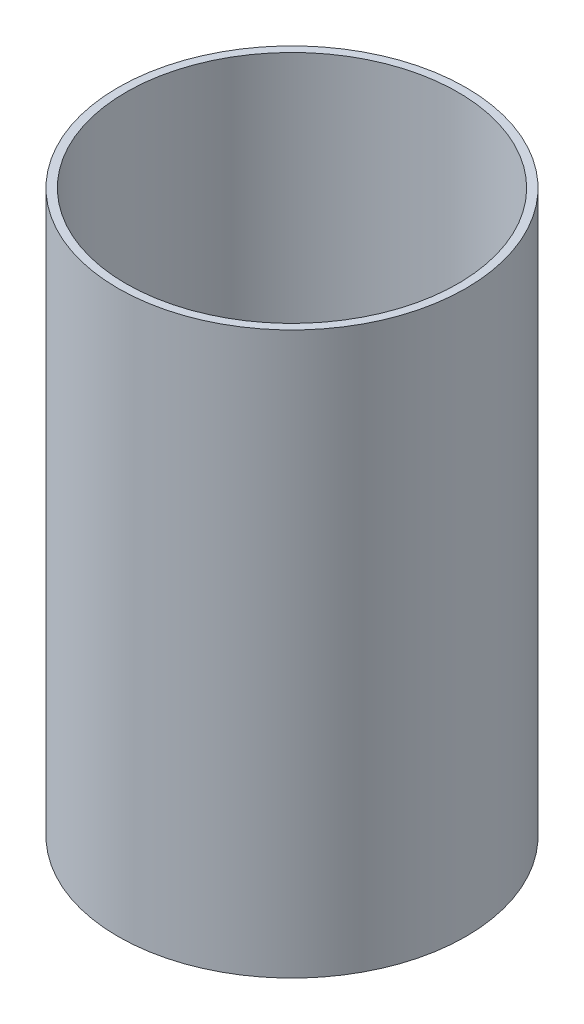
ISO-10303-21;
HEADER;
FILE_DESCRIPTION(('STEP AP214'),'2;1');
FILE_NAME('part.step','',(''),(''),'','','');
FILE_SCHEMA(('AUTOMOTIVE_DESIGN { 1 0 10303 214 1 1 1 1 }'));
ENDSEC;
DATA;
#1=APPLICATION_CONTEXT('core data for automotive mechanical design processes');
#2=APPLICATION_PROTOCOL_DEFINITION('international standard','automotive_design',2000,#1);
#3=PRODUCT_CONTEXT('',#1,'mechanical');
#4=PRODUCT('Part','Part','',(#3));
#5=PRODUCT_RELATED_PRODUCT_CATEGORY('part','',(#4));
#6=PRODUCT_DEFINITION_FORMATION('','',#4);
#7=PRODUCT_DEFINITION_CONTEXT('part definition',#1,'design');
#8=PRODUCT_DEFINITION('design','',#6,#7);
#9=PRODUCT_DEFINITION_SHAPE('','',#8);
#10=(LENGTH_UNIT() NAMED_UNIT(*) SI_UNIT(.MILLI.,.METRE.));
#11=(NAMED_UNIT(*) PLANE_ANGLE_UNIT() SI_UNIT($,.RADIAN.));
#12=(NAMED_UNIT(*) SI_UNIT($,.STERADIAN.) SOLID_ANGLE_UNIT());
#13=UNCERTAINTY_MEASURE_WITH_UNIT(LENGTH_MEASURE(1.E-05),#10,'distance_accuracy_value','');
#14=(GEOMETRIC_REPRESENTATION_CONTEXT(3) GLOBAL_UNCERTAINTY_ASSIGNED_CONTEXT((#13)) GLOBAL_UNIT_ASSIGNED_CONTEXT((#10,
#11,#12)) REPRESENTATION_CONTEXT('',''));
#15=CARTESIAN_POINT('',(0.,0.,0.));
#16=DIRECTION('',(0.,0.,1.));
#17=DIRECTION('',(1.,0.,0.));
#18=AXIS2_PLACEMENT_3D('',#15,#16,#17);
#19=CARTESIAN_POINT('',(0.,354.6856,0.));
#20=DIRECTION('',(0.,1.,0.));
#21=DIRECTION('',(0.,0.,1.));
#22=AXIS2_PLACEMENT_3D('',#19,#20,#21);
#23=PLANE('',#22);
#24=CARTESIAN_POINT('',(0.,354.6856,0.));
#25=DIRECTION('',(0.,1.,0.));
#26=DIRECTION('',(0.,0.,1.));
#27=AXIS2_PLACEMENT_3D('',#24,#25,#26);
#28=CIRCLE('',#27,109.9312);
#29=CARTESIAN_POINT('',(0.,354.6856,109.9312));
#30=VERTEX_POINT('',#29);
#31=EDGE_CURVE('E10',#30,#30,#28,.T.);
#32=ORIENTED_EDGE('',*,*,#31,.T.);
#33=EDGE_LOOP('',(#32));
#34=FACE_BOUND('',#33,.T.);
#35=CARTESIAN_POINT('',(0.,354.6856,0.));
#36=DIRECTION('',(0.,1.,0.));
#37=DIRECTION('',(0.,0.,1.));
#38=AXIS2_PLACEMENT_3D('',#35,#36,#37);
#39=CIRCLE('',#38,104.8512);
#40=CARTESIAN_POINT('',(0.,354.6856,104.8512));
#41=VERTEX_POINT('',#40);
#42=EDGE_CURVE('E50',#41,#41,#39,.T.);
#43=ORIENTED_EDGE('',*,*,#42,.F.);
#44=EDGE_LOOP('',(#43));
#45=FACE_BOUND('',#44,.T.);
#46=ADVANCED_FACE('F37',(#34,#45),#23,.T.);
#47=CARTESIAN_POINT('',(0.,0.,0.));
#48=DIRECTION('',(0.,1.,0.));
#49=DIRECTION('',(0.,0.,1.));
#50=AXIS2_PLACEMENT_3D('',#47,#48,#49);
#51=PLANE('',#50);
#52=CARTESIAN_POINT('',(0.,0.,0.));
#53=DIRECTION('',(0.,1.,0.));
#54=DIRECTION('',(0.,0.,1.));
#55=AXIS2_PLACEMENT_3D('',#52,#53,#54);
#56=CIRCLE('',#55,109.9312);
#57=CARTESIAN_POINT('',(0.,0.,109.9312));
#58=VERTEX_POINT('',#57);
#59=EDGE_CURVE('E41',#58,#58,#56,.T.);
#60=ORIENTED_EDGE('',*,*,#59,.F.);
#61=EDGE_LOOP('',(#60));
#62=FACE_BOUND('',#61,.T.);
#63=CARTESIAN_POINT('',(0.,0.,0.));
#64=DIRECTION('',(0.,1.,0.));
#65=DIRECTION('',(0.,0.,1.));
#66=AXIS2_PLACEMENT_3D('',#63,#64,#65);
#67=CIRCLE('',#66,104.8512);
#68=CARTESIAN_POINT('',(0.,0.,104.8512));
#69=VERTEX_POINT('',#68);
#70=EDGE_CURVE('E52',#69,#69,#67,.T.);
#71=ORIENTED_EDGE('',*,*,#70,.T.);
#72=EDGE_LOOP('',(#71));
#73=FACE_BOUND('',#72,.T.);
#74=ADVANCED_FACE('F64',(#62,#73),#51,.F.);
#75=CARTESIAN_POINT('',(0.,354.6856,0.));
#76=DIRECTION('',(0.,-1.,0.));
#77=DIRECTION('',(0.,0.,-1.));
#78=AXIS2_PLACEMENT_3D('',#75,#76,#77);
#79=CYLINDRICAL_SURFACE('',#78,109.9312);
#80=ORIENTED_EDGE('',*,*,#31,.F.);
#81=EDGE_LOOP('',(#80));
#82=FACE_BOUND('',#81,.T.);
#83=ORIENTED_EDGE('',*,*,#59,.T.);
#84=EDGE_LOOP('',(#83));
#85=FACE_BOUND('',#84,.T.);
#86=ADVANCED_FACE('F39',(#82,#85),#79,.T.);
#87=CARTESIAN_POINT('',(0.,354.6856,0.));
#88=DIRECTION('',(0.,-1.,0.));
#89=DIRECTION('',(0.,0.,-1.));
#90=AXIS2_PLACEMENT_3D('',#87,#88,#89);
#91=CYLINDRICAL_SURFACE('',#90,104.8512);
#92=ORIENTED_EDGE('',*,*,#42,.T.);
#93=EDGE_LOOP('',(#92));
#94=FACE_BOUND('',#93,.T.);
#95=ORIENTED_EDGE('',*,*,#70,.F.);
#96=EDGE_LOOP('',(#95));
#97=FACE_BOUND('',#96,.T.);
#98=ADVANCED_FACE('F60',(#94,#97),#91,.F.);
#99=CLOSED_SHELL('',(#46,#74,#86,#98));
#100=MANIFOLD_SOLID_BREP('B2',#99);
#101=ADVANCED_BREP_SHAPE_REPRESENTATION('',(#18,#100),#14);
#102=SHAPE_DEFINITION_REPRESENTATION(#9,#101);
ENDSEC;
END-ISO-10303-21;
